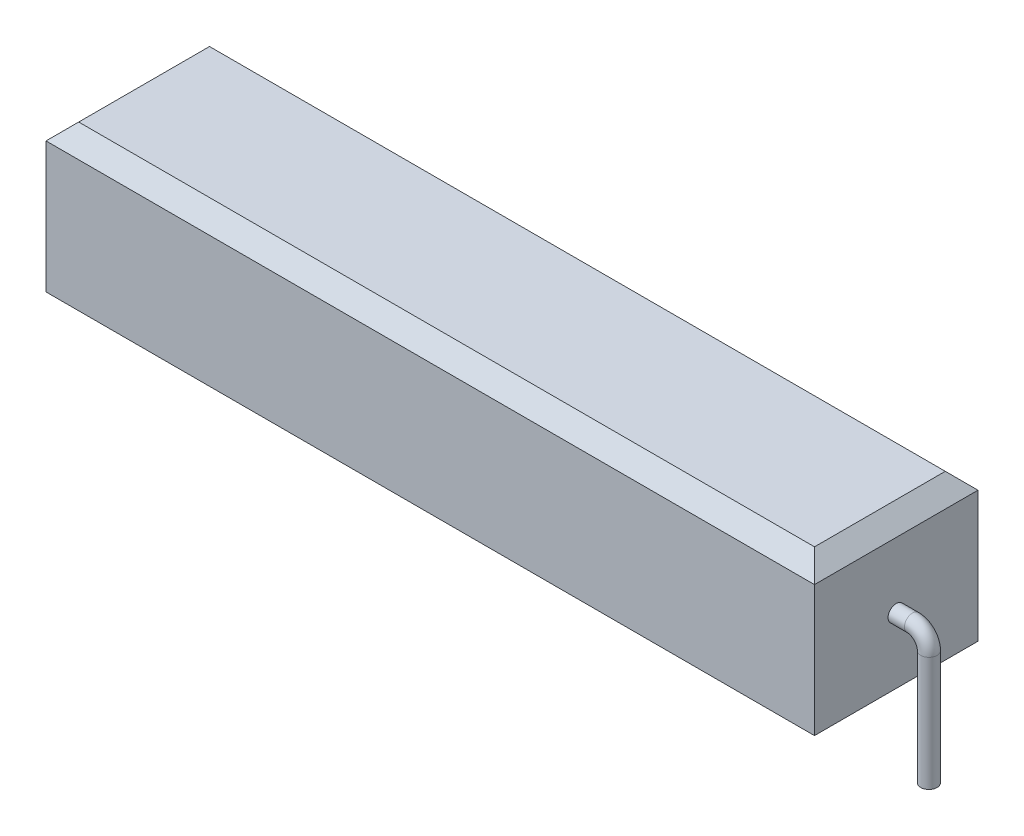
ISO-10303-21;
HEADER;
FILE_DESCRIPTION(('STEP AP214'),'2;1');
FILE_NAME('part.step','',(''),(''),'','','');
FILE_SCHEMA(('AUTOMOTIVE_DESIGN { 1 0 10303 214 1 1 1 1 }'));
ENDSEC;
DATA;
#1=APPLICATION_CONTEXT('core data for automotive mechanical design processes');
#2=APPLICATION_PROTOCOL_DEFINITION('international standard','automotive_design',2000,#1);
#3=PRODUCT_CONTEXT('',#1,'mechanical');
#4=PRODUCT('Part','Part','',(#3));
#5=PRODUCT_RELATED_PRODUCT_CATEGORY('part','',(#4));
#6=PRODUCT_DEFINITION_FORMATION('','',#4);
#7=PRODUCT_DEFINITION_CONTEXT('part definition',#1,'design');
#8=PRODUCT_DEFINITION('design','',#6,#7);
#9=PRODUCT_DEFINITION_SHAPE('','',#8);
#10=(LENGTH_UNIT() NAMED_UNIT(*) SI_UNIT(.MILLI.,.METRE.));
#11=(NAMED_UNIT(*) PLANE_ANGLE_UNIT() SI_UNIT($,.RADIAN.));
#12=(NAMED_UNIT(*) SI_UNIT($,.STERADIAN.) SOLID_ANGLE_UNIT());
#13=UNCERTAINTY_MEASURE_WITH_UNIT(LENGTH_MEASURE(1.E-05),#10,'distance_accuracy_value','');
#14=(GEOMETRIC_REPRESENTATION_CONTEXT(3) GLOBAL_UNCERTAINTY_ASSIGNED_CONTEXT((#13)) GLOBAL_UNIT_ASSIGNED_CONTEXT((#10,
#11,#12)) REPRESENTATION_CONTEXT('',''));
#15=CARTESIAN_POINT('',(0.,0.,0.));
#16=DIRECTION('',(0.,0.,1.));
#17=DIRECTION('',(1.,0.,0.));
#18=AXIS2_PLACEMENT_3D('',#15,#16,#17);
#19=CARTESIAN_POINT('',(23.5,5.,5.));
#20=DIRECTION('',(-1.,0.,0.));
#21=DIRECTION('',(0.,0.,1.));
#22=AXIS2_PLACEMENT_3D('',#19,#20,#21);
#23=PLANE('',#22);
#24=CARTESIAN_POINT('',(23.5,0.,0.));
#25=DIRECTION('',(-1.,0.,0.));
#26=DIRECTION('',(0.,0.,1.));
#27=AXIS2_PLACEMENT_3D('',#24,#25,#26);
#28=CIRCLE('',#27,0.5);
#29=CARTESIAN_POINT('',(23.5,0.,0.5));
#30=VERTEX_POINT('',#29);
#31=EDGE_CURVE('E71',#30,#30,#28,.F.);
#32=ORIENTED_EDGE('',*,*,#31,.F.);
#33=EDGE_LOOP('',(#32));
#34=FACE_BOUND('',#33,.T.);
#35=DIRECTION('',(0.,-1.,0.));
#36=VECTOR('',#35,1.);
#37=CARTESIAN_POINT('',(23.5,5.,5.));
#38=LINE('',#37,#36);
#39=CARTESIAN_POINT('',(23.5,3.99999999999999,5.));
#40=VERTEX_POINT('',#39);
#41=CARTESIAN_POINT('',(23.5,-4.,5.));
#42=VERTEX_POINT('',#41);
#43=EDGE_CURVE('E183',#40,#42,#38,.T.);
#44=ORIENTED_EDGE('',*,*,#43,.T.);
#45=DIRECTION('',(0.,0.,-1.));
#46=VECTOR('',#45,1.);
#47=CARTESIAN_POINT('',(23.5,-4.,-5.));
#48=LINE('',#47,#46);
#49=CARTESIAN_POINT('',(23.5,-4.,-5.));
#50=VERTEX_POINT('',#49);
#51=EDGE_CURVE('E195',#42,#50,#48,.T.);
#52=ORIENTED_EDGE('',*,*,#51,.T.);
#53=DIRECTION('',(0.,-1.,0.));
#54=VECTOR('',#53,1.);
#55=CARTESIAN_POINT('',(23.5,5.,-5.));
#56=LINE('',#55,#54);
#57=CARTESIAN_POINT('',(23.5,3.99999999999999,-5.));
#58=VERTEX_POINT('',#57);
#59=EDGE_CURVE('E150',#58,#50,#56,.T.);
#60=ORIENTED_EDGE('',*,*,#59,.F.);
#61=DIRECTION('',(0.,0.,1.));
#62=VECTOR('',#61,1.);
#63=CARTESIAN_POINT('',(23.5,3.99999999999999,5.));
#64=LINE('',#63,#62);
#65=EDGE_CURVE('E197',#58,#40,#64,.T.);
#66=ORIENTED_EDGE('',*,*,#65,.T.);
#67=EDGE_LOOP('',(#44,#52,#60,#66));
#68=FACE_BOUND('',#67,.T.);
#69=ADVANCED_FACE('F62',(#34,#68),#23,.F.);
#70=CARTESIAN_POINT('',(-23.5,5.,-5.));
#71=DIRECTION('',(0.,0.,1.));
#72=DIRECTION('',(1.,0.,0.));
#73=AXIS2_PLACEMENT_3D('',#70,#71,#72);
#74=PLANE('',#73);
#75=ORIENTED_EDGE('',*,*,#59,.T.);
#76=DIRECTION('',(-1.,0.,0.));
#77=VECTOR('',#76,1.);
#78=CARTESIAN_POINT('',(-23.5,-4.,-5.));
#79=LINE('',#78,#77);
#80=CARTESIAN_POINT('',(-23.5,-4.,-5.));
#81=VERTEX_POINT('',#80);
#82=EDGE_CURVE('E149',#50,#81,#79,.T.);
#83=ORIENTED_EDGE('',*,*,#82,.T.);
#84=DIRECTION('',(0.,-1.,0.));
#85=VECTOR('',#84,1.);
#86=CARTESIAN_POINT('',(-23.5,5.,-5.));
#87=LINE('',#86,#85);
#88=CARTESIAN_POINT('',(-23.5,3.99999999999999,-5.));
#89=VERTEX_POINT('',#88);
#90=EDGE_CURVE('E132',#89,#81,#87,.T.);
#91=ORIENTED_EDGE('',*,*,#90,.F.);
#92=DIRECTION('',(1.,0.,0.));
#93=VECTOR('',#92,1.);
#94=CARTESIAN_POINT('',(-23.5,3.99999999999999,-5.));
#95=LINE('',#94,#93);
#96=EDGE_CURVE('E146',#89,#58,#95,.T.);
#97=ORIENTED_EDGE('',*,*,#96,.T.);
#98=EDGE_LOOP('',(#75,#83,#91,#97));
#99=FACE_BOUND('',#98,.T.);
#100=ADVANCED_FACE('F145',(#99),#74,.F.);
#101=CARTESIAN_POINT('',(-23.5,5.,5.));
#102=DIRECTION('',(1.,0.,0.));
#103=DIRECTION('',(0.,0.,-1.));
#104=AXIS2_PLACEMENT_3D('',#101,#102,#103);
#105=PLANE('',#104);
#106=CARTESIAN_POINT('',(-23.5,0.,0.));
#107=DIRECTION('',(1.,0.,0.));
#108=DIRECTION('',(0.,0.,-1.));
#109=AXIS2_PLACEMENT_3D('',#106,#107,#108);
#110=CIRCLE('',#109,0.5);
#111=CARTESIAN_POINT('',(-23.5,0.,-0.5));
#112=VERTEX_POINT('',#111);
#113=EDGE_CURVE('E12',#112,#112,#110,.F.);
#114=ORIENTED_EDGE('',*,*,#113,.F.);
#115=EDGE_LOOP('',(#114));
#116=FACE_BOUND('',#115,.T.);
#117=ORIENTED_EDGE('',*,*,#90,.T.);
#118=DIRECTION('',(0.,0.,1.));
#119=VECTOR('',#118,1.);
#120=CARTESIAN_POINT('',(-23.5,-4.,5.));
#121=LINE('',#120,#119);
#122=CARTESIAN_POINT('',(-23.5,-4.,5.));
#123=VERTEX_POINT('',#122);
#124=EDGE_CURVE('E138',#81,#123,#121,.T.);
#125=ORIENTED_EDGE('',*,*,#124,.T.);
#126=DIRECTION('',(0.,-1.,0.));
#127=VECTOR('',#126,1.);
#128=CARTESIAN_POINT('',(-23.5,5.,5.));
#129=LINE('',#128,#127);
#130=CARTESIAN_POINT('',(-23.5,3.99999999999999,5.));
#131=VERTEX_POINT('',#130);
#132=EDGE_CURVE('E134',#131,#123,#129,.T.);
#133=ORIENTED_EDGE('',*,*,#132,.F.);
#134=DIRECTION('',(0.,0.,-1.));
#135=VECTOR('',#134,1.);
#136=CARTESIAN_POINT('',(-23.5,3.99999999999999,5.));
#137=LINE('',#136,#135);
#138=EDGE_CURVE('E129',#131,#89,#137,.T.);
#139=ORIENTED_EDGE('',*,*,#138,.T.);
#140=EDGE_LOOP('',(#117,#125,#133,#139));
#141=FACE_BOUND('',#140,.T.);
#142=ADVANCED_FACE('F131',(#116,#141),#105,.F.);
#143=CARTESIAN_POINT('',(-23.5,5.,5.));
#144=DIRECTION('',(0.,0.,-1.));
#145=DIRECTION('',(-1.,0.,0.));
#146=AXIS2_PLACEMENT_3D('',#143,#144,#145);
#147=PLANE('',#146);
#148=ORIENTED_EDGE('',*,*,#132,.T.);
#149=DIRECTION('',(1.,0.,0.));
#150=VECTOR('',#149,1.);
#151=CARTESIAN_POINT('',(23.5,-4.,5.));
#152=LINE('',#151,#150);
#153=EDGE_CURVE('E201',#123,#42,#152,.T.);
#154=ORIENTED_EDGE('',*,*,#153,.T.);
#155=ORIENTED_EDGE('',*,*,#43,.F.);
#156=DIRECTION('',(-1.,0.,0.));
#157=VECTOR('',#156,1.);
#158=CARTESIAN_POINT('',(-23.5,3.99999999999999,5.));
#159=LINE('',#158,#157);
#160=EDGE_CURVE('E189',#40,#131,#159,.T.);
#161=ORIENTED_EDGE('',*,*,#160,.T.);
#162=EDGE_LOOP('',(#148,#154,#155,#161));
#163=FACE_BOUND('',#162,.T.);
#164=ADVANCED_FACE('F341',(#163),#147,.F.);
#165=CARTESIAN_POINT('',(0.,5.,0.));
#166=DIRECTION('',(0.,-1.,0.));
#167=DIRECTION('',(0.,0.,-1.));
#168=AXIS2_PLACEMENT_3D('',#165,#166,#167);
#169=PLANE('',#168);
#170=DIRECTION('',(0.,0.,1.));
#171=VECTOR('',#170,1.);
#172=CARTESIAN_POINT('',(-22.5,5.,0.));
#173=LINE('',#172,#171);
#174=CARTESIAN_POINT('',(-22.5,5.,-3.99999999999999));
#175=VERTEX_POINT('',#174);
#176=CARTESIAN_POINT('',(-22.5,5.,3.99999999999999));
#177=VERTEX_POINT('',#176);
#178=EDGE_CURVE('E78',#175,#177,#173,.T.);
#179=ORIENTED_EDGE('',*,*,#178,.T.);
#180=DIRECTION('',(1.,0.,0.));
#181=VECTOR('',#180,1.);
#182=CARTESIAN_POINT('',(0.,5.,3.99999999999999));
#183=LINE('',#182,#181);
#184=CARTESIAN_POINT('',(22.5,5.,3.99999999999999));
#185=VERTEX_POINT('',#184);
#186=EDGE_CURVE('E168',#177,#185,#183,.T.);
#187=ORIENTED_EDGE('',*,*,#186,.T.);
#188=DIRECTION('',(0.,0.,-1.));
#189=VECTOR('',#188,1.);
#190=CARTESIAN_POINT('',(22.5,5.,0.));
#191=LINE('',#190,#189);
#192=CARTESIAN_POINT('',(22.5,5.,-3.99999999999999));
#193=VERTEX_POINT('',#192);
#194=EDGE_CURVE('E193',#185,#193,#191,.T.);
#195=ORIENTED_EDGE('',*,*,#194,.T.);
#196=DIRECTION('',(-1.,0.,0.));
#197=VECTOR('',#196,1.);
#198=CARTESIAN_POINT('',(0.,5.,-3.99999999999999));
#199=LINE('',#198,#197);
#200=EDGE_CURVE('E83',#193,#175,#199,.T.);
#201=ORIENTED_EDGE('',*,*,#200,.T.);
#202=EDGE_LOOP('',(#179,#187,#195,#201));
#203=FACE_BOUND('',#202,.T.);
#204=ADVANCED_FACE('F333',(#203),#169,.F.);
#205=CARTESIAN_POINT('',(0.,-5.,0.));
#206=DIRECTION('',(0.,-1.,0.));
#207=DIRECTION('',(0.,0.,-1.));
#208=AXIS2_PLACEMENT_3D('',#205,#206,#207);
#209=PLANE('',#208);
#210=DIRECTION('',(0.,0.,-1.));
#211=VECTOR('',#210,1.);
#212=CARTESIAN_POINT('',(-22.5,-5.,-5.));
#213=LINE('',#212,#211);
#214=CARTESIAN_POINT('',(-22.5,-5.,3.99999999999999));
#215=VERTEX_POINT('',#214);
#216=CARTESIAN_POINT('',(-22.5,-5.,-3.99999999999999));
#217=VERTEX_POINT('',#216);
#218=EDGE_CURVE('E207',#215,#217,#213,.T.);
#219=ORIENTED_EDGE('',*,*,#218,.T.);
#220=DIRECTION('',(1.,0.,0.));
#221=VECTOR('',#220,1.);
#222=CARTESIAN_POINT('',(23.5,-5.,-3.99999999999999));
#223=LINE('',#222,#221);
#224=CARTESIAN_POINT('',(22.5,-5.,-3.99999999999999));
#225=VERTEX_POINT('',#224);
#226=EDGE_CURVE('E139',#217,#225,#223,.T.);
#227=ORIENTED_EDGE('',*,*,#226,.T.);
#228=DIRECTION('',(0.,0.,1.));
#229=VECTOR('',#228,1.);
#230=CARTESIAN_POINT('',(22.5,-5.,5.));
#231=LINE('',#230,#229);
#232=CARTESIAN_POINT('',(22.5,-5.,3.99999999999999));
#233=VERTEX_POINT('',#232);
#234=EDGE_CURVE('E211',#225,#233,#231,.T.);
#235=ORIENTED_EDGE('',*,*,#234,.T.);
#236=DIRECTION('',(-1.,0.,0.));
#237=VECTOR('',#236,1.);
#238=CARTESIAN_POINT('',(-23.5,-5.,3.99999999999999));
#239=LINE('',#238,#237);
#240=EDGE_CURVE('E209',#233,#215,#239,.T.);
#241=ORIENTED_EDGE('',*,*,#240,.T.);
#242=EDGE_LOOP('',(#219,#227,#235,#241));
#243=FACE_BOUND('',#242,.T.);
#244=ADVANCED_FACE('F290',(#243),#209,.T.);
#245=CARTESIAN_POINT('',(-23.5,-4.,5.));
#246=DIRECTION('',(0.,-0.70710678118655,0.707106781186545));
#247=DIRECTION('',(-1.,0.,0.));
#248=AXIS2_PLACEMENT_3D('',#245,#246,#247);
#249=PLANE('',#248);
#250=DIRECTION('',(0.577350269189627,-0.577350269189623,-0.577350269189627));
#251=VECTOR('',#250,1.);
#252=CARTESIAN_POINT('',(-23.5,-4.,5.));
#253=LINE('',#252,#251);
#254=EDGE_CURVE('E177',#215,#123,#253,.F.);
#255=ORIENTED_EDGE('',*,*,#254,.F.);
#256=ORIENTED_EDGE('',*,*,#240,.F.);
#257=DIRECTION('',(-0.577350269189627,-0.577350269189623,-0.577350269189627));
#258=VECTOR('',#257,1.);
#259=CARTESIAN_POINT('',(23.5,-4.,5.));
#260=LINE('',#259,#258);
#261=EDGE_CURVE('E180',#42,#233,#260,.T.);
#262=ORIENTED_EDGE('',*,*,#261,.F.);
#263=ORIENTED_EDGE('',*,*,#153,.F.);
#264=EDGE_LOOP('',(#255,#256,#262,#263));
#265=FACE_BOUND('',#264,.T.);
#266=ADVANCED_FACE('F284',(#265),#249,.T.);
#267=CARTESIAN_POINT('',(23.5,-4.,5.));
#268=DIRECTION('',(0.707106781186545,-0.70710678118655,0.));
#269=DIRECTION('',(0.,0.,1.));
#270=AXIS2_PLACEMENT_3D('',#267,#268,#269);
#271=PLANE('',#270);
#272=ORIENTED_EDGE('',*,*,#261,.T.);
#273=ORIENTED_EDGE('',*,*,#234,.F.);
#274=DIRECTION('',(0.577350269189627,0.577350269189623,-0.577350269189627));
#275=VECTOR('',#274,1.);
#276=CARTESIAN_POINT('',(20.1666666666667,-7.33333333333332,-1.66666666666665));
#277=LINE('',#276,#275);
#278=EDGE_CURVE('E162',#50,#225,#277,.F.);
#279=ORIENTED_EDGE('',*,*,#278,.F.);
#280=ORIENTED_EDGE('',*,*,#51,.F.);
#281=EDGE_LOOP('',(#272,#273,#279,#280));
#282=FACE_BOUND('',#281,.T.);
#283=ADVANCED_FACE('F277',(#282),#271,.T.);
#284=CARTESIAN_POINT('',(-23.5,-4.,5.));
#285=DIRECTION('',(-0.707106781186545,-0.70710678118655,0.));
#286=DIRECTION('',(0.,0.,-1.));
#287=AXIS2_PLACEMENT_3D('',#284,#285,#286);
#288=PLANE('',#287);
#289=ORIENTED_EDGE('',*,*,#254,.T.);
#290=ORIENTED_EDGE('',*,*,#124,.F.);
#291=DIRECTION('',(0.577350269189627,-0.577350269189623,0.577350269189627));
#292=VECTOR('',#291,1.);
#293=CARTESIAN_POINT('',(-20.1666666666667,-7.33333333333332,-1.66666666666665));
#294=LINE('',#293,#292);
#295=EDGE_CURVE('E160',#217,#81,#294,.F.);
#296=ORIENTED_EDGE('',*,*,#295,.F.);
#297=ORIENTED_EDGE('',*,*,#218,.F.);
#298=EDGE_LOOP('',(#289,#290,#296,#297));
#299=FACE_BOUND('',#298,.T.);
#300=ADVANCED_FACE('F270',(#299),#288,.T.);
#301=CARTESIAN_POINT('',(-23.5,-4.,-5.));
#302=DIRECTION('',(0.,-0.70710678118655,-0.707106781186545));
#303=DIRECTION('',(1.,0.,0.));
#304=AXIS2_PLACEMENT_3D('',#301,#302,#303);
#305=PLANE('',#304);
#306=ORIENTED_EDGE('',*,*,#278,.T.);
#307=ORIENTED_EDGE('',*,*,#226,.F.);
#308=ORIENTED_EDGE('',*,*,#295,.T.);
#309=ORIENTED_EDGE('',*,*,#82,.F.);
#310=EDGE_LOOP('',(#306,#307,#308,#309));
#311=FACE_BOUND('',#310,.T.);
#312=ADVANCED_FACE('F264',(#311),#305,.T.);
#313=CARTESIAN_POINT('',(0.,5.,-3.99999999999999));
#314=DIRECTION('',(0.,-0.707106781186545,0.70710678118655));
#315=DIRECTION('',(-1.,0.,0.));
#316=AXIS2_PLACEMENT_3D('',#313,#314,#315);
#317=PLANE('',#316);
#318=DIRECTION('',(-0.577350269189625,0.577350269189629,0.577350269189625));
#319=VECTOR('',#318,1.);
#320=CARTESIAN_POINT('',(21.1666666666667,6.33333333333333,-2.66666666666667));
#321=LINE('',#320,#319);
#322=EDGE_CURVE('E156',#58,#193,#321,.T.);
#323=ORIENTED_EDGE('',*,*,#322,.F.);
#324=ORIENTED_EDGE('',*,*,#96,.F.);
#325=DIRECTION('',(0.577350269189625,0.577350269189629,0.577350269189625));
#326=VECTOR('',#325,1.);
#327=CARTESIAN_POINT('',(-15.,12.5,3.49999999999997));
#328=LINE('',#327,#326);
#329=EDGE_CURVE('E154',#175,#89,#328,.F.);
#330=ORIENTED_EDGE('',*,*,#329,.F.);
#331=ORIENTED_EDGE('',*,*,#200,.F.);
#332=EDGE_LOOP('',(#323,#324,#330,#331));
#333=FACE_BOUND('',#332,.T.);
#334=ADVANCED_FACE('F65',(#333),#317,.F.);
#335=CARTESIAN_POINT('',(-22.5,5.,0.));
#336=DIRECTION('',(0.70710678118655,-0.707106781186545,0.));
#337=DIRECTION('',(0.,0.,1.));
#338=AXIS2_PLACEMENT_3D('',#335,#336,#337);
#339=PLANE('',#338);
#340=ORIENTED_EDGE('',*,*,#329,.T.);
#341=ORIENTED_EDGE('',*,*,#138,.F.);
#342=DIRECTION('',(0.577350269189625,0.577350269189629,-0.577350269189625));
#343=VECTOR('',#342,1.);
#344=CARTESIAN_POINT('',(-21.1666666666667,6.33333333333333,2.66666666666667));
#345=LINE('',#344,#343);
#346=EDGE_CURVE('E164',#177,#131,#345,.F.);
#347=ORIENTED_EDGE('',*,*,#346,.F.);
#348=ORIENTED_EDGE('',*,*,#178,.F.);
#349=EDGE_LOOP('',(#340,#341,#347,#348));
#350=FACE_BOUND('',#349,.T.);
#351=ADVANCED_FACE('F159',(#350),#339,.F.);
#352=CARTESIAN_POINT('',(22.5,5.,0.));
#353=DIRECTION('',(-0.70710678118655,-0.707106781186545,0.));
#354=DIRECTION('',(0.,0.,-1.));
#355=AXIS2_PLACEMENT_3D('',#352,#353,#354);
#356=PLANE('',#355);
#357=ORIENTED_EDGE('',*,*,#322,.T.);
#358=ORIENTED_EDGE('',*,*,#194,.F.);
#359=DIRECTION('',(0.577350269189625,-0.577350269189629,0.577350269189625));
#360=VECTOR('',#359,1.);
#361=CARTESIAN_POINT('',(21.1666666666667,6.33333333333333,2.66666666666667));
#362=LINE('',#361,#360);
#363=EDGE_CURVE('E184',#40,#185,#362,.F.);
#364=ORIENTED_EDGE('',*,*,#363,.F.);
#365=ORIENTED_EDGE('',*,*,#65,.F.);
#366=EDGE_LOOP('',(#357,#358,#364,#365));
#367=FACE_BOUND('',#366,.T.);
#368=ADVANCED_FACE('F194',(#367),#356,.F.);
#369=CARTESIAN_POINT('',(0.,5.,3.99999999999999));
#370=DIRECTION('',(0.,-0.707106781186545,-0.70710678118655));
#371=DIRECTION('',(1.,0.,0.));
#372=AXIS2_PLACEMENT_3D('',#369,#370,#371);
#373=PLANE('',#372);
#374=ORIENTED_EDGE('',*,*,#346,.T.);
#375=ORIENTED_EDGE('',*,*,#160,.F.);
#376=ORIENTED_EDGE('',*,*,#363,.T.);
#377=ORIENTED_EDGE('',*,*,#186,.F.);
#378=EDGE_LOOP('',(#374,#375,#376,#377));
#379=FACE_BOUND('',#378,.T.);
#380=ADVANCED_FACE('F188',(#379),#373,.F.);
#381=CARTESIAN_POINT('',(25.5,-8.,0.));
#382=DIRECTION('',(0.,1.,0.));
#383=DIRECTION('',(0.,0.,1.));
#384=AXIS2_PLACEMENT_3D('',#381,#382,#383);
#385=PLANE('',#384);
#386=CARTESIAN_POINT('',(25.5,-8.,0.));
#387=DIRECTION('',(0.,1.,0.));
#388=DIRECTION('',(0.,0.,1.));
#389=AXIS2_PLACEMENT_3D('',#386,#387,#388);
#390=CIRCLE('',#389,0.5);
#391=CARTESIAN_POINT('',(25.5,-8.,0.5));
#392=VERTEX_POINT('',#391);
#393=EDGE_CURVE('E185',#392,#392,#390,.T.);
#394=ORIENTED_EDGE('',*,*,#393,.F.);
#395=EDGE_LOOP('',(#394));
#396=FACE_BOUND('',#395,.T.);
#397=ADVANCED_FACE('F250',(#396),#385,.F.);
#398=CARTESIAN_POINT('',(23.5,0.,0.));
#399=DIRECTION('',(1.,0.,0.));
#400=DIRECTION('',(0.,1.,0.));
#401=AXIS2_PLACEMENT_3D('',#398,#399,#400);
#402=CYLINDRICAL_SURFACE('',#401,0.5);
#403=CARTESIAN_POINT('',(24.5,0.,0.));
#404=DIRECTION('',(-1.,0.,0.));
#405=DIRECTION('',(0.,0.,1.));
#406=AXIS2_PLACEMENT_3D('',#403,#404,#405);
#407=CIRCLE('',#406,0.5);
#408=CARTESIAN_POINT('',(24.5,0.499999999999997,0.));
#409=VERTEX_POINT('',#408);
#410=EDGE_CURVE('E223',#409,#409,#407,.T.);
#411=ORIENTED_EDGE('',*,*,#410,.T.);
#412=EDGE_LOOP('',(#411));
#413=FACE_BOUND('',#412,.T.);
#414=ORIENTED_EDGE('',*,*,#31,.T.);
#415=EDGE_LOOP('',(#414));
#416=FACE_BOUND('',#415,.T.);
#417=ADVANCED_FACE('F406',(#413,#416),#402,.T.);
#418=CARTESIAN_POINT('',(24.5,-1.,0.));
#419=DIRECTION('',(0.,0.,-1.));
#420=DIRECTION('',(-1.,0.,0.));
#421=AXIS2_PLACEMENT_3D('',#418,#419,#420);
#422=TOROIDAL_SURFACE('',#421,1.,0.5);
#423=CARTESIAN_POINT('',(25.5,-0.999999999999853,0.));
#424=DIRECTION('',(0.,1.,0.));
#425=DIRECTION('',(0.,0.,1.));
#426=AXIS2_PLACEMENT_3D('',#423,#424,#425);
#427=CIRCLE('',#426,0.5);
#428=CARTESIAN_POINT('',(26.,-0.999999999999778,0.));
#429=VERTEX_POINT('',#428);
#430=EDGE_CURVE('E220',#429,#429,#427,.T.);
#431=CARTESIAN_POINT('',(24.5,-1.,0.));
#432=DIRECTION('',(0.,0.,-1.));
#433=DIRECTION('',(-1.,0.,0.));
#434=AXIS2_PLACEMENT_3D('',#431,#432,#433);
#435=CIRCLE('',#434,1.5);
#436=EDGE_CURVE('',#409,#429,#435,.T.);
#437=ORIENTED_EDGE('',*,*,#410,.F.);
#438=ORIENTED_EDGE('',*,*,#430,.T.);
#439=ORIENTED_EDGE('',*,*,#436,.T.);
#440=ORIENTED_EDGE('',*,*,#436,.F.);
#441=EDGE_LOOP('',(#437,#439,#438,#440));
#442=FACE_BOUND('',#441,.T.);
#443=ADVANCED_FACE('F415',(#442),#422,.T.);
#444=CARTESIAN_POINT('',(25.5,-1.00000000000001,0.));
#445=DIRECTION('',(0.,-1.,0.));
#446=DIRECTION('',(1.,0.,0.));
#447=AXIS2_PLACEMENT_3D('',#444,#445,#446);
#448=CYLINDRICAL_SURFACE('',#447,0.5);
#449=ORIENTED_EDGE('',*,*,#393,.T.);
#450=EDGE_LOOP('',(#449));
#451=FACE_BOUND('',#450,.T.);
#452=ORIENTED_EDGE('',*,*,#430,.F.);
#453=EDGE_LOOP('',(#452));
#454=FACE_BOUND('',#453,.T.);
#455=ADVANCED_FACE('F298',(#451,#454),#448,.T.);
#456=CARTESIAN_POINT('',(-25.5,-8.,0.));
#457=DIRECTION('',(0.,1.,0.));
#458=DIRECTION('',(0.,0.,1.));
#459=AXIS2_PLACEMENT_3D('',#456,#457,#458);
#460=PLANE('',#459);
#461=CARTESIAN_POINT('',(-25.5,-8.,0.));
#462=DIRECTION('',(0.,1.,0.));
#463=DIRECTION('',(0.,0.,1.));
#464=AXIS2_PLACEMENT_3D('',#461,#462,#463);
#465=CIRCLE('',#464,0.5);
#466=CARTESIAN_POINT('',(-25.5,-8.,0.5));
#467=VERTEX_POINT('',#466);
#468=EDGE_CURVE('E226',#467,#467,#465,.T.);
#469=ORIENTED_EDGE('',*,*,#468,.F.);
#470=EDGE_LOOP('',(#469));
#471=FACE_BOUND('',#470,.T.);
#472=ADVANCED_FACE('F251',(#471),#460,.F.);
#473=CARTESIAN_POINT('',(-23.5,0.,0.));
#474=DIRECTION('',(-1.,0.,0.));
#475=DIRECTION('',(0.,-1.,0.));
#476=AXIS2_PLACEMENT_3D('',#473,#474,#475);
#477=CYLINDRICAL_SURFACE('',#476,0.5);
#478=CARTESIAN_POINT('',(-24.5,0.,0.));
#479=DIRECTION('',(1.,0.,0.));
#480=DIRECTION('',(0.,0.,1.));
#481=AXIS2_PLACEMENT_3D('',#478,#479,#480);
#482=CIRCLE('',#481,0.5);
#483=CARTESIAN_POINT('',(-24.5,0.499999999999997,0.));
#484=VERTEX_POINT('',#483);
#485=EDGE_CURVE('E232',#484,#484,#482,.T.);
#486=ORIENTED_EDGE('',*,*,#485,.T.);
#487=EDGE_LOOP('',(#486));
#488=FACE_BOUND('',#487,.T.);
#489=ORIENTED_EDGE('',*,*,#113,.T.);
#490=EDGE_LOOP('',(#489));
#491=FACE_BOUND('',#490,.T.);
#492=ADVANCED_FACE('F236',(#488,#491),#477,.T.);
#493=CARTESIAN_POINT('',(-24.5,-1.,0.));
#494=DIRECTION('',(0.,0.,1.));
#495=DIRECTION('',(1.,0.,0.));
#496=AXIS2_PLACEMENT_3D('',#493,#494,#495);
#497=TOROIDAL_SURFACE('',#496,1.,0.5);
#498=CARTESIAN_POINT('',(-25.5000000000001,-0.99999999999985,0.));
#499=DIRECTION('',(0.,1.,0.));
#500=DIRECTION('',(0.,0.,1.));
#501=AXIS2_PLACEMENT_3D('',#498,#499,#500);
#502=CIRCLE('',#501,0.5);
#503=CARTESIAN_POINT('',(-26.,-0.999999999999773,0.));
#504=VERTEX_POINT('',#503);
#505=EDGE_CURVE('E229',#504,#504,#502,.T.);
#506=CARTESIAN_POINT('',(-24.5,-1.,0.));
#507=DIRECTION('',(0.,0.,1.));
#508=DIRECTION('',(1.,0.,0.));
#509=AXIS2_PLACEMENT_3D('',#506,#507,#508);
#510=CIRCLE('',#509,1.5);
#511=EDGE_CURVE('',#484,#504,#510,.T.);
#512=ORIENTED_EDGE('',*,*,#485,.F.);
#513=ORIENTED_EDGE('',*,*,#505,.T.);
#514=ORIENTED_EDGE('',*,*,#511,.T.);
#515=ORIENTED_EDGE('',*,*,#511,.F.);
#516=EDGE_LOOP('',(#512,#514,#513,#515));
#517=FACE_BOUND('',#516,.T.);
#518=ADVANCED_FACE('F239',(#517),#497,.T.);
#519=CARTESIAN_POINT('',(-25.5,-1.00000000000001,0.));
#520=DIRECTION('',(0.,-1.,0.));
#521=DIRECTION('',(1.,0.,0.));
#522=AXIS2_PLACEMENT_3D('',#519,#520,#521);
#523=CYLINDRICAL_SURFACE('',#522,0.5);
#524=ORIENTED_EDGE('',*,*,#468,.T.);
#525=EDGE_LOOP('',(#524));
#526=FACE_BOUND('',#525,.T.);
#527=ORIENTED_EDGE('',*,*,#505,.F.);
#528=EDGE_LOOP('',(#527));
#529=FACE_BOUND('',#528,.T.);
#530=ADVANCED_FACE('F241',(#526,#529),#523,.T.);
#531=CLOSED_SHELL('',(#69,#100,#142,#164,#204,#244,#266,#283,#300,#312,#334,#351,#368,#380,#397,
#417,#443,#455,#472,#492,#518,#530));
#532=MANIFOLD_SOLID_BREP('B2',#531);
#533=ADVANCED_BREP_SHAPE_REPRESENTATION('',(#18,#532),#14);
#534=SHAPE_DEFINITION_REPRESENTATION(#9,#533);
ENDSEC;
END-ISO-10303-21;
